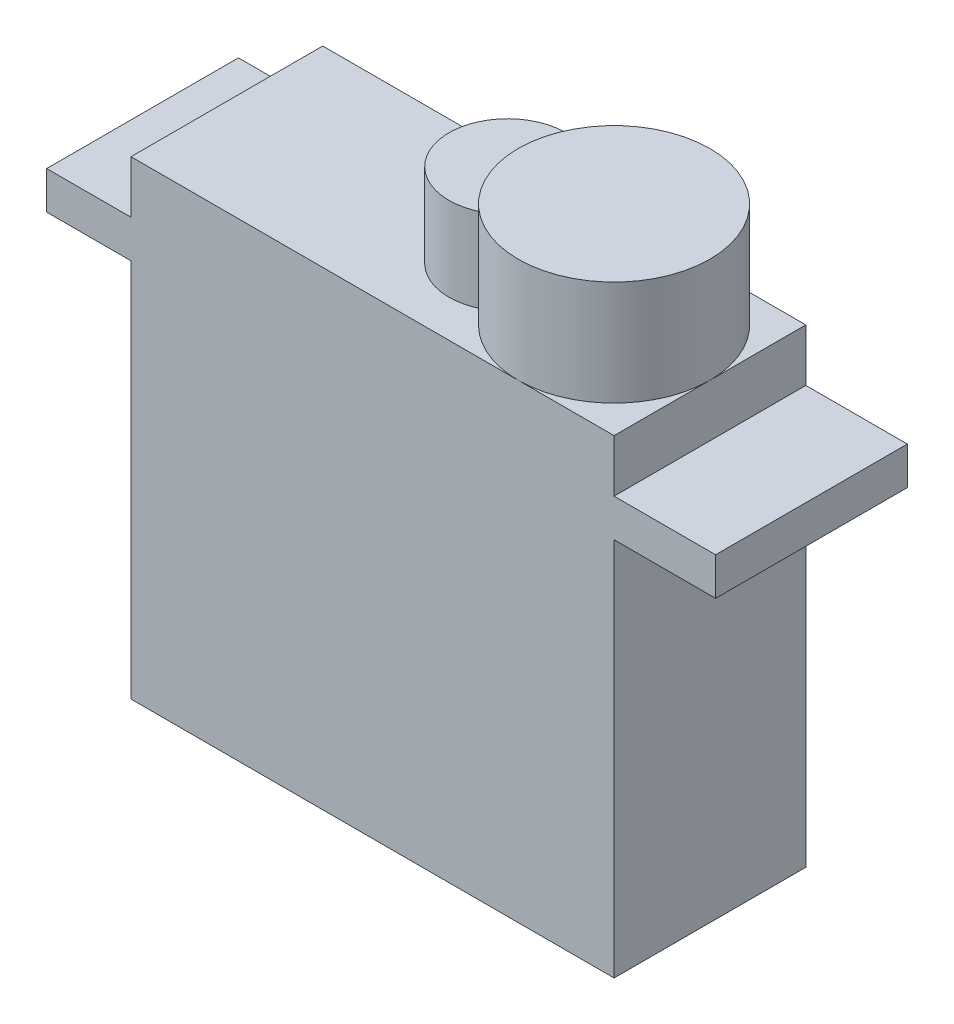
ISO-10303-21;
HEADER;
FILE_DESCRIPTION(('STEP AP214'),'2;1');
FILE_NAME('part.step','',(''),(''),'','','');
FILE_SCHEMA(('AUTOMOTIVE_DESIGN { 1 0 10303 214 1 1 1 1 }'));
ENDSEC;
DATA;
#1=APPLICATION_CONTEXT('core data for automotive mechanical design processes');
#2=APPLICATION_PROTOCOL_DEFINITION('international standard','automotive_design',2000,#1);
#3=PRODUCT_CONTEXT('',#1,'mechanical');
#4=PRODUCT('Part','Part','',(#3));
#5=PRODUCT_RELATED_PRODUCT_CATEGORY('part','',(#4));
#6=PRODUCT_DEFINITION_FORMATION('','',#4);
#7=PRODUCT_DEFINITION_CONTEXT('part definition',#1,'design');
#8=PRODUCT_DEFINITION('design','',#6,#7);
#9=PRODUCT_DEFINITION_SHAPE('','',#8);
#10=(LENGTH_UNIT() NAMED_UNIT(*) SI_UNIT(.MILLI.,.METRE.));
#11=(NAMED_UNIT(*) PLANE_ANGLE_UNIT() SI_UNIT($,.RADIAN.));
#12=(NAMED_UNIT(*) SI_UNIT($,.STERADIAN.) SOLID_ANGLE_UNIT());
#13=UNCERTAINTY_MEASURE_WITH_UNIT(LENGTH_MEASURE(1.E-05),#10,'distance_accuracy_value','');
#14=(GEOMETRIC_REPRESENTATION_CONTEXT(3) GLOBAL_UNCERTAINTY_ASSIGNED_CONTEXT((#13)) GLOBAL_UNIT_ASSIGNED_CONTEXT((#10,
#11,#12)) REPRESENTATION_CONTEXT('',''));
#15=CARTESIAN_POINT('',(0.,0.,0.));
#16=DIRECTION('',(0.,0.,1.));
#17=DIRECTION('',(1.,0.,0.));
#18=AXIS2_PLACEMENT_3D('',#15,#16,#17);
#19=CARTESIAN_POINT('',(0.,4.3,-9.144));
#20=DIRECTION('',(0.,-1.,0.));
#21=DIRECTION('',(0.,0.,-1.));
#22=AXIS2_PLACEMENT_3D('',#19,#20,#21);
#23=PLANE('',#22);
#24=CARTESIAN_POINT('',(13.3858,4.3,-4.572));
#25=DIRECTION('',(0.,1.,0.));
#26=DIRECTION('',(0.,0.,1.));
#27=AXIS2_PLACEMENT_3D('',#24,#25,#26);
#28=CIRCLE('',#27,2.794);
#29=CARTESIAN_POINT('',(14.63675,4.3,-7.07031144925928));
#30=VERTEX_POINT('',#29);
#31=CARTESIAN_POINT('',(14.63675,4.3,-2.07368855074072));
#32=VERTEX_POINT('',#31);
#33=EDGE_CURVE('E140',#30,#32,#28,.T.);
#34=ORIENTED_EDGE('',*,*,#33,.F.);
#35=CARTESIAN_POINT('',(18.4658,4.3,-4.572));
#36=DIRECTION('',(0.,1.,0.));
#37=DIRECTION('',(0.,0.,1.));
#38=AXIS2_PLACEMENT_3D('',#35,#36,#37);
#39=CIRCLE('',#38,4.572);
#40=CARTESIAN_POINT('',(18.4658,4.3,-9.144));
#41=VERTEX_POINT('',#40);
#42=EDGE_CURVE('E54',#41,#30,#39,.T.);
#43=ORIENTED_EDGE('',*,*,#42,.F.);
#44=DIRECTION('',(-1.,0.,0.));
#45=VECTOR('',#44,1.);
#46=CARTESIAN_POINT('',(0.,4.3,-9.144));
#47=LINE('',#46,#45);
#48=CARTESIAN_POINT('',(0.,4.3,-9.144));
#49=VERTEX_POINT('',#48);
#50=EDGE_CURVE('E351',#41,#49,#47,.T.);
#51=ORIENTED_EDGE('',*,*,#50,.T.);
#52=DIRECTION('',(0.,0.,1.));
#53=VECTOR('',#52,1.);
#54=CARTESIAN_POINT('',(0.,4.3,0.));
#55=LINE('',#54,#53);
#56=CARTESIAN_POINT('',(0.,4.3,0.));
#57=VERTEX_POINT('',#56);
#58=EDGE_CURVE('E179',#49,#57,#55,.T.);
#59=ORIENTED_EDGE('',*,*,#58,.T.);
#60=DIRECTION('',(1.,0.,0.));
#61=VECTOR('',#60,1.);
#62=CARTESIAN_POINT('',(0.,4.3,0.));
#63=LINE('',#62,#61);
#64=CARTESIAN_POINT('',(18.4658,4.3,0.));
#65=VERTEX_POINT('',#64);
#66=EDGE_CURVE('E154',#57,#65,#63,.T.);
#67=ORIENTED_EDGE('',*,*,#66,.T.);
#68=EDGE_CURVE('E150',#32,#65,#39,.T.);
#69=ORIENTED_EDGE('',*,*,#68,.F.);
#70=EDGE_LOOP('',(#34,#43,#51,#59,#67,#69));
#71=FACE_BOUND('',#70,.T.);
#72=ADVANCED_FACE('F32',(#71),#23,.F.);
#73=CARTESIAN_POINT('',(18.4658,9.3,-4.572));
#74=DIRECTION('',(0.,-1.,0.));
#75=DIRECTION('',(0.,0.,-1.));
#76=AXIS2_PLACEMENT_3D('',#73,#74,#75);
#77=CYLINDRICAL_SURFACE('',#76,4.572);
#78=CARTESIAN_POINT('',(18.4658,9.3,-4.572));
#79=DIRECTION('',(0.,1.,0.));
#80=DIRECTION('',(0.,0.,1.));
#81=AXIS2_PLACEMENT_3D('',#78,#79,#80);
#82=CIRCLE('',#81,4.572);
#83=CARTESIAN_POINT('',(18.4658,9.3,0.));
#84=VERTEX_POINT('',#83);
#85=EDGE_CURVE('E165',#84,#84,#82,.T.);
#86=ORIENTED_EDGE('',*,*,#85,.F.);
#87=EDGE_LOOP('',(#86));
#88=FACE_BOUND('',#87,.T.);
#89=DIRECTION('',(0.,-1.,0.));
#90=VECTOR('',#89,1.);
#91=CARTESIAN_POINT('',(14.63675,6.3,-7.07031144925928));
#92=LINE('',#91,#90);
#93=CARTESIAN_POINT('',(14.63675,8.3,-7.07031144925928));
#94=VERTEX_POINT('',#93);
#95=EDGE_CURVE('E11',#94,#30,#92,.T.);
#96=ORIENTED_EDGE('',*,*,#95,.F.);
#97=CARTESIAN_POINT('',(18.4658,8.3,-4.572));
#98=DIRECTION('',(0.,1.,0.));
#99=DIRECTION('',(0.,0.,1.));
#100=AXIS2_PLACEMENT_3D('',#97,#98,#99);
#101=CIRCLE('',#100,4.572);
#102=CARTESIAN_POINT('',(14.63675,8.3,-2.07368855074072));
#103=VERTEX_POINT('',#102);
#104=EDGE_CURVE('E152',#94,#103,#101,.T.);
#105=ORIENTED_EDGE('',*,*,#104,.T.);
#106=DIRECTION('',(0.,-1.,0.));
#107=VECTOR('',#106,1.);
#108=CARTESIAN_POINT('',(14.63675,6.3,-2.07368855074072));
#109=LINE('',#108,#107);
#110=EDGE_CURVE('E40',#32,#103,#109,.F.);
#111=ORIENTED_EDGE('',*,*,#110,.F.);
#112=ORIENTED_EDGE('',*,*,#68,.T.);
#113=CARTESIAN_POINT('',(23.0378,4.3,-4.572));
#114=VERTEX_POINT('',#113);
#115=EDGE_CURVE('E159',#65,#114,#39,.T.);
#116=ORIENTED_EDGE('',*,*,#115,.T.);
#117=EDGE_CURVE('E158',#114,#41,#39,.T.);
#118=ORIENTED_EDGE('',*,*,#117,.T.);
#119=ORIENTED_EDGE('',*,*,#42,.T.);
#120=EDGE_LOOP('',(#96,#105,#111,#112,#116,#118,#119));
#121=FACE_BOUND('',#120,.T.);
#122=ADVANCED_FACE('F148',(#88,#121),#77,.T.);
#123=ORIENTED_EDGE('',*,*,#115,.F.);
#124=CARTESIAN_POINT('',(23.0378,4.3,0.));
#125=VERTEX_POINT('',#124);
#126=EDGE_CURVE('E345',#65,#125,#63,.T.);
#127=ORIENTED_EDGE('',*,*,#126,.T.);
#128=DIRECTION('',(0.,0.,-1.));
#129=VECTOR('',#128,1.);
#130=CARTESIAN_POINT('',(23.0378,4.3,0.));
#131=LINE('',#130,#129);
#132=EDGE_CURVE('E348',#125,#114,#131,.T.);
#133=ORIENTED_EDGE('',*,*,#132,.T.);
#134=EDGE_LOOP('',(#123,#127,#133));
#135=FACE_BOUND('',#134,.T.);
#136=ADVANCED_FACE('F330',(#135),#23,.F.);
#137=ORIENTED_EDGE('',*,*,#117,.F.);
#138=CARTESIAN_POINT('',(23.0378,4.3,-9.144));
#139=VERTEX_POINT('',#138);
#140=EDGE_CURVE('E352',#114,#139,#131,.T.);
#141=ORIENTED_EDGE('',*,*,#140,.T.);
#142=EDGE_CURVE('E191',#139,#41,#47,.T.);
#143=ORIENTED_EDGE('',*,*,#142,.T.);
#144=EDGE_LOOP('',(#137,#141,#143));
#145=FACE_BOUND('',#144,.T.);
#146=ADVANCED_FACE('F329',(#145),#23,.F.);
#147=CARTESIAN_POINT('',(-4.02098022277668,1.8,0.));
#148=DIRECTION('',(0.,1.,0.));
#149=DIRECTION('',(0.,0.,1.));
#150=AXIS2_PLACEMENT_3D('',#147,#148,#149);
#151=PLANE('',#150);
#152=DIRECTION('',(0.,0.,1.));
#153=VECTOR('',#152,1.);
#154=CARTESIAN_POINT('',(0.,1.8,0.));
#155=LINE('',#154,#153);
#156=CARTESIAN_POINT('',(0.,1.8,-9.144));
#157=VERTEX_POINT('',#156);
#158=CARTESIAN_POINT('',(0.,1.8,0.));
#159=VERTEX_POINT('',#158);
#160=EDGE_CURVE('E168',#157,#159,#155,.T.);
#161=ORIENTED_EDGE('',*,*,#160,.F.);
#162=DIRECTION('',(-1.,0.,0.));
#163=VECTOR('',#162,1.);
#164=CARTESIAN_POINT('',(-4.02098022277668,1.8,-9.144));
#165=LINE('',#164,#163);
#166=CARTESIAN_POINT('',(-4.02098022277668,1.8,-9.144));
#167=VERTEX_POINT('',#166);
#168=EDGE_CURVE('E199',#157,#167,#165,.T.);
#169=ORIENTED_EDGE('',*,*,#168,.T.);
#170=DIRECTION('',(0.,0.,1.));
#171=VECTOR('',#170,1.);
#172=CARTESIAN_POINT('',(-4.02098022277668,1.8,-9.144));
#173=LINE('',#172,#171);
#174=CARTESIAN_POINT('',(-4.02098022277668,1.8,0.));
#175=VERTEX_POINT('',#174);
#176=EDGE_CURVE('E195',#167,#175,#173,.T.);
#177=ORIENTED_EDGE('',*,*,#176,.T.);
#178=DIRECTION('',(1.,0.,0.));
#179=VECTOR('',#178,1.);
#180=CARTESIAN_POINT('',(-4.02098022277668,1.8,0.));
#181=LINE('',#180,#179);
#182=EDGE_CURVE('E309',#175,#159,#181,.T.);
#183=ORIENTED_EDGE('',*,*,#182,.T.);
#184=EDGE_LOOP('',(#161,#169,#177,#183));
#185=FACE_BOUND('',#184,.T.);
#186=ADVANCED_FACE('F338',(#185),#151,.T.);
#187=CARTESIAN_POINT('',(0.,-18.1,0.));
#188=DIRECTION('',(-1.,0.,0.));
#189=DIRECTION('',(0.,0.,1.));
#190=AXIS2_PLACEMENT_3D('',#187,#188,#189);
#191=PLANE('',#190);
#192=DIRECTION('',(0.,0.,1.));
#193=VECTOR('',#192,1.);
#194=CARTESIAN_POINT('',(0.,0.,0.));
#195=LINE('',#194,#193);
#196=CARTESIAN_POINT('',(0.,0.,-9.144));
#197=VERTEX_POINT('',#196);
#198=CARTESIAN_POINT('',(0.,0.,0.));
#199=VERTEX_POINT('',#198);
#200=EDGE_CURVE('E253',#197,#199,#195,.T.);
#201=ORIENTED_EDGE('',*,*,#200,.F.);
#202=DIRECTION('',(0.,1.,0.));
#203=VECTOR('',#202,1.);
#204=CARTESIAN_POINT('',(0.,-18.1,-9.144));
#205=LINE('',#204,#203);
#206=CARTESIAN_POINT('',(0.,-18.1,-9.144));
#207=VERTEX_POINT('',#206);
#208=EDGE_CURVE('E156',#207,#197,#205,.T.);
#209=ORIENTED_EDGE('',*,*,#208,.F.);
#210=DIRECTION('',(0.,0.,1.));
#211=VECTOR('',#210,1.);
#212=CARTESIAN_POINT('',(0.,-18.1,0.));
#213=LINE('',#212,#211);
#214=CARTESIAN_POINT('',(0.,-18.1,0.));
#215=VERTEX_POINT('',#214);
#216=EDGE_CURVE('E261',#207,#215,#213,.T.);
#217=ORIENTED_EDGE('',*,*,#216,.T.);
#218=DIRECTION('',(0.,1.,0.));
#219=VECTOR('',#218,1.);
#220=CARTESIAN_POINT('',(0.,-18.1,0.));
#221=LINE('',#220,#219);
#222=EDGE_CURVE('E280',#215,#199,#221,.T.);
#223=ORIENTED_EDGE('',*,*,#222,.T.);
#224=EDGE_LOOP('',(#201,#209,#217,#223));
#225=FACE_BOUND('',#224,.T.);
#226=ADVANCED_FACE('F34',(#225),#191,.T.);
#227=CARTESIAN_POINT('',(0.,-18.1,-9.144));
#228=DIRECTION('',(0.,0.,-1.));
#229=DIRECTION('',(-1.,0.,0.));
#230=AXIS2_PLACEMENT_3D('',#227,#228,#229);
#231=PLANE('',#230);
#232=ORIENTED_EDGE('',*,*,#208,.T.);
#233=DIRECTION('',(-1.,0.,0.));
#234=VECTOR('',#233,1.);
#235=CARTESIAN_POINT('',(-4.02098022277668,0.,-9.144));
#236=LINE('',#235,#234);
#237=CARTESIAN_POINT('',(-4.02098022277668,0.,-9.144));
#238=VERTEX_POINT('',#237);
#239=EDGE_CURVE('E236',#197,#238,#236,.T.);
#240=ORIENTED_EDGE('',*,*,#239,.T.);
#241=DIRECTION('',(0.,-1.,0.));
#242=VECTOR('',#241,1.);
#243=CARTESIAN_POINT('',(-4.02098022277668,1.8,-9.144));
#244=LINE('',#243,#242);
#245=EDGE_CURVE('E242',#167,#238,#244,.T.);
#246=ORIENTED_EDGE('',*,*,#245,.F.);
#247=ORIENTED_EDGE('',*,*,#168,.F.);
#248=DIRECTION('',(0.,-1.,0.));
#249=VECTOR('',#248,1.);
#250=CARTESIAN_POINT('',(0.,4.3,-9.144));
#251=LINE('',#250,#249);
#252=EDGE_CURVE('E186',#49,#157,#251,.T.);
#253=ORIENTED_EDGE('',*,*,#252,.F.);
#254=ORIENTED_EDGE('',*,*,#50,.F.);
#255=ORIENTED_EDGE('',*,*,#142,.F.);
#256=DIRECTION('',(0.,-1.,0.));
#257=VECTOR('',#256,1.);
#258=CARTESIAN_POINT('',(23.0378,4.3,-9.144));
#259=LINE('',#258,#257);
#260=CARTESIAN_POINT('',(23.0378,1.8,-9.144));
#261=VERTEX_POINT('',#260);
#262=EDGE_CURVE('E202',#139,#261,#259,.T.);
#263=ORIENTED_EDGE('',*,*,#262,.T.);
#264=CARTESIAN_POINT('',(27.8790197772233,1.8,-9.144));
#265=VERTEX_POINT('',#264);
#266=EDGE_CURVE('E246',#265,#261,#165,.T.);
#267=ORIENTED_EDGE('',*,*,#266,.F.);
#268=DIRECTION('',(0.,-1.,0.));
#269=VECTOR('',#268,1.);
#270=CARTESIAN_POINT('',(27.8790197772233,1.8,-9.144));
#271=LINE('',#270,#269);
#272=CARTESIAN_POINT('',(27.8790197772233,0.,-9.144));
#273=VERTEX_POINT('',#272);
#274=EDGE_CURVE('E245',#265,#273,#271,.T.);
#275=ORIENTED_EDGE('',*,*,#274,.T.);
#276=CARTESIAN_POINT('',(23.0378,0.,-9.144));
#277=VERTEX_POINT('',#276);
#278=EDGE_CURVE('E238',#273,#277,#236,.T.);
#279=ORIENTED_EDGE('',*,*,#278,.T.);
#280=DIRECTION('',(0.,1.,0.));
#281=VECTOR('',#280,1.);
#282=CARTESIAN_POINT('',(23.0378,-18.1,-9.144));
#283=LINE('',#282,#281);
#284=CARTESIAN_POINT('',(23.0378,-18.1,-9.144));
#285=VERTEX_POINT('',#284);
#286=EDGE_CURVE('E160',#285,#277,#283,.T.);
#287=ORIENTED_EDGE('',*,*,#286,.F.);
#288=DIRECTION('',(-1.,0.,0.));
#289=VECTOR('',#288,1.);
#290=CARTESIAN_POINT('',(0.,-18.1,-9.144));
#291=LINE('',#290,#289);
#292=EDGE_CURVE('E271',#285,#207,#291,.T.);
#293=ORIENTED_EDGE('',*,*,#292,.T.);
#294=EDGE_LOOP('',(#232,#240,#246,#247,#253,#254,#255,#263,#267,#275,#279,#287,#293));
#295=FACE_BOUND('',#294,.T.);
#296=ADVANCED_FACE('F302',(#295),#231,.T.);
#297=CARTESIAN_POINT('',(23.0378,-18.1,0.));
#298=DIRECTION('',(1.,0.,0.));
#299=DIRECTION('',(0.,0.,-1.));
#300=AXIS2_PLACEMENT_3D('',#297,#298,#299);
#301=PLANE('',#300);
#302=DIRECTION('',(0.,0.,-1.));
#303=VECTOR('',#302,1.);
#304=CARTESIAN_POINT('',(23.0378,0.,0.));
#305=LINE('',#304,#303);
#306=CARTESIAN_POINT('',(23.0378,0.,0.));
#307=VERTEX_POINT('',#306);
#308=EDGE_CURVE('E255',#307,#277,#305,.T.);
#309=ORIENTED_EDGE('',*,*,#308,.F.);
#310=DIRECTION('',(0.,1.,0.));
#311=VECTOR('',#310,1.);
#312=CARTESIAN_POINT('',(23.0378,-18.1,0.));
#313=LINE('',#312,#311);
#314=CARTESIAN_POINT('',(23.0378,-18.1,0.));
#315=VERTEX_POINT('',#314);
#316=EDGE_CURVE('E276',#315,#307,#313,.T.);
#317=ORIENTED_EDGE('',*,*,#316,.F.);
#318=DIRECTION('',(0.,0.,-1.));
#319=VECTOR('',#318,1.);
#320=CARTESIAN_POINT('',(23.0378,-18.1,0.));
#321=LINE('',#320,#319);
#322=EDGE_CURVE('E285',#315,#285,#321,.T.);
#323=ORIENTED_EDGE('',*,*,#322,.T.);
#324=ORIENTED_EDGE('',*,*,#286,.T.);
#325=EDGE_LOOP('',(#309,#317,#323,#324));
#326=FACE_BOUND('',#325,.T.);
#327=ADVANCED_FACE('F319',(#326),#301,.T.);
#328=CARTESIAN_POINT('',(0.,-18.1,0.));
#329=DIRECTION('',(0.,0.,1.));
#330=DIRECTION('',(1.,0.,0.));
#331=AXIS2_PLACEMENT_3D('',#328,#329,#330);
#332=PLANE('',#331);
#333=ORIENTED_EDGE('',*,*,#316,.T.);
#334=DIRECTION('',(1.,0.,0.));
#335=VECTOR('',#334,1.);
#336=CARTESIAN_POINT('',(-4.02098022277668,0.,0.));
#337=LINE('',#336,#335);
#338=CARTESIAN_POINT('',(27.8790197772233,0.,0.));
#339=VERTEX_POINT('',#338);
#340=EDGE_CURVE('E216',#307,#339,#337,.T.);
#341=ORIENTED_EDGE('',*,*,#340,.T.);
#342=DIRECTION('',(0.,-1.,0.));
#343=VECTOR('',#342,1.);
#344=CARTESIAN_POINT('',(27.8790197772233,1.8,0.));
#345=LINE('',#344,#343);
#346=CARTESIAN_POINT('',(27.8790197772233,1.8,0.));
#347=VERTEX_POINT('',#346);
#348=EDGE_CURVE('E249',#347,#339,#345,.T.);
#349=ORIENTED_EDGE('',*,*,#348,.F.);
#350=CARTESIAN_POINT('',(23.0378,1.8,0.));
#351=VERTEX_POINT('',#350);
#352=EDGE_CURVE('E308',#351,#347,#181,.T.);
#353=ORIENTED_EDGE('',*,*,#352,.F.);
#354=DIRECTION('',(0.,-1.,0.));
#355=VECTOR('',#354,1.);
#356=CARTESIAN_POINT('',(23.0378,4.3,0.));
#357=LINE('',#356,#355);
#358=EDGE_CURVE('E205',#125,#351,#357,.T.);
#359=ORIENTED_EDGE('',*,*,#358,.F.);
#360=ORIENTED_EDGE('',*,*,#126,.F.);
#361=ORIENTED_EDGE('',*,*,#66,.F.);
#362=DIRECTION('',(0.,-1.,0.));
#363=VECTOR('',#362,1.);
#364=CARTESIAN_POINT('',(0.,4.3,0.));
#365=LINE('',#364,#363);
#366=EDGE_CURVE('E210',#57,#159,#365,.T.);
#367=ORIENTED_EDGE('',*,*,#366,.T.);
#368=ORIENTED_EDGE('',*,*,#182,.F.);
#369=DIRECTION('',(0.,-1.,0.));
#370=VECTOR('',#369,1.);
#371=CARTESIAN_POINT('',(-4.02098022277668,1.8,0.));
#372=LINE('',#371,#370);
#373=CARTESIAN_POINT('',(-4.02098022277668,0.,0.));
#374=VERTEX_POINT('',#373);
#375=EDGE_CURVE('E251',#175,#374,#372,.T.);
#376=ORIENTED_EDGE('',*,*,#375,.T.);
#377=EDGE_CURVE('E222',#374,#199,#337,.T.);
#378=ORIENTED_EDGE('',*,*,#377,.T.);
#379=ORIENTED_EDGE('',*,*,#222,.F.);
#380=DIRECTION('',(1.,0.,0.));
#381=VECTOR('',#380,1.);
#382=CARTESIAN_POINT('',(0.,-18.1,0.));
#383=LINE('',#382,#381);
#384=EDGE_CURVE('E289',#215,#315,#383,.T.);
#385=ORIENTED_EDGE('',*,*,#384,.T.);
#386=EDGE_LOOP('',(#333,#341,#349,#353,#359,#360,#361,#367,#368,#376,#378,#379,#385));
#387=FACE_BOUND('',#386,.T.);
#388=ADVANCED_FACE('F298',(#387),#332,.T.);
#389=CARTESIAN_POINT('',(0.,-18.1,-9.144));
#390=DIRECTION('',(0.,-1.,0.));
#391=DIRECTION('',(0.,0.,-1.));
#392=AXIS2_PLACEMENT_3D('',#389,#390,#391);
#393=PLANE('',#392);
#394=ORIENTED_EDGE('',*,*,#216,.F.);
#395=ORIENTED_EDGE('',*,*,#292,.F.);
#396=ORIENTED_EDGE('',*,*,#322,.F.);
#397=ORIENTED_EDGE('',*,*,#384,.F.);
#398=EDGE_LOOP('',(#394,#395,#396,#397));
#399=FACE_BOUND('',#398,.T.);
#400=ADVANCED_FACE('F297',(#399),#393,.T.);
#401=CARTESIAN_POINT('',(-4.02098022277668,0.,0.));
#402=DIRECTION('',(0.,1.,0.));
#403=DIRECTION('',(0.,0.,1.));
#404=AXIS2_PLACEMENT_3D('',#401,#402,#403);
#405=PLANE('',#404);
#406=ORIENTED_EDGE('',*,*,#239,.F.);
#407=ORIENTED_EDGE('',*,*,#200,.T.);
#408=ORIENTED_EDGE('',*,*,#377,.F.);
#409=DIRECTION('',(0.,0.,1.));
#410=VECTOR('',#409,1.);
#411=CARTESIAN_POINT('',(-4.02098022277668,0.,-9.144));
#412=LINE('',#411,#410);
#413=EDGE_CURVE('E213',#238,#374,#412,.T.);
#414=ORIENTED_EDGE('',*,*,#413,.F.);
#415=EDGE_LOOP('',(#406,#407,#408,#414));
#416=FACE_BOUND('',#415,.T.);
#417=ADVANCED_FACE('F300',(#416),#405,.F.);
#418=ORIENTED_EDGE('',*,*,#340,.F.);
#419=ORIENTED_EDGE('',*,*,#308,.T.);
#420=ORIENTED_EDGE('',*,*,#278,.F.);
#421=DIRECTION('',(0.,0.,-1.));
#422=VECTOR('',#421,1.);
#423=CARTESIAN_POINT('',(27.8790197772233,0.,-9.144));
#424=LINE('',#423,#422);
#425=EDGE_CURVE('E229',#339,#273,#424,.T.);
#426=ORIENTED_EDGE('',*,*,#425,.F.);
#427=EDGE_LOOP('',(#418,#419,#420,#426));
#428=FACE_BOUND('',#427,.T.);
#429=ADVANCED_FACE('F318',(#428),#405,.F.);
#430=CARTESIAN_POINT('',(-4.02098022277668,1.8,-9.144));
#431=DIRECTION('',(1.,0.,0.));
#432=DIRECTION('',(0.,0.,-1.));
#433=AXIS2_PLACEMENT_3D('',#430,#431,#432);
#434=PLANE('',#433);
#435=ORIENTED_EDGE('',*,*,#413,.T.);
#436=ORIENTED_EDGE('',*,*,#375,.F.);
#437=ORIENTED_EDGE('',*,*,#176,.F.);
#438=ORIENTED_EDGE('',*,*,#245,.T.);
#439=EDGE_LOOP('',(#435,#436,#437,#438));
#440=FACE_BOUND('',#439,.T.);
#441=ADVANCED_FACE('F305',(#440),#434,.F.);
#442=CARTESIAN_POINT('',(27.8790197772233,1.8,-9.144));
#443=DIRECTION('',(-1.,0.,0.));
#444=DIRECTION('',(0.,0.,1.));
#445=AXIS2_PLACEMENT_3D('',#442,#443,#444);
#446=PLANE('',#445);
#447=ORIENTED_EDGE('',*,*,#425,.T.);
#448=ORIENTED_EDGE('',*,*,#274,.F.);
#449=DIRECTION('',(0.,0.,-1.));
#450=VECTOR('',#449,1.);
#451=CARTESIAN_POINT('',(27.8790197772233,1.8,-9.144));
#452=LINE('',#451,#450);
#453=EDGE_CURVE('E484',#347,#265,#452,.T.);
#454=ORIENTED_EDGE('',*,*,#453,.F.);
#455=ORIENTED_EDGE('',*,*,#348,.T.);
#456=EDGE_LOOP('',(#447,#448,#454,#455));
#457=FACE_BOUND('',#456,.T.);
#458=ADVANCED_FACE('F366',(#457),#446,.F.);
#459=DIRECTION('',(0.,0.,-1.));
#460=VECTOR('',#459,1.);
#461=CARTESIAN_POINT('',(23.0378,1.8,0.));
#462=LINE('',#461,#460);
#463=EDGE_CURVE('E173',#351,#261,#462,.T.);
#464=ORIENTED_EDGE('',*,*,#463,.F.);
#465=ORIENTED_EDGE('',*,*,#352,.T.);
#466=ORIENTED_EDGE('',*,*,#453,.T.);
#467=ORIENTED_EDGE('',*,*,#266,.T.);
#468=EDGE_LOOP('',(#464,#465,#466,#467));
#469=FACE_BOUND('',#468,.T.);
#470=ADVANCED_FACE('F359',(#469),#151,.T.);
#471=CARTESIAN_POINT('',(0.,4.3,0.));
#472=DIRECTION('',(1.,0.,0.));
#473=DIRECTION('',(0.,0.,-1.));
#474=AXIS2_PLACEMENT_3D('',#471,#472,#473);
#475=PLANE('',#474);
#476=ORIENTED_EDGE('',*,*,#160,.T.);
#477=ORIENTED_EDGE('',*,*,#366,.F.);
#478=ORIENTED_EDGE('',*,*,#58,.F.);
#479=ORIENTED_EDGE('',*,*,#252,.T.);
#480=EDGE_LOOP('',(#476,#477,#478,#479));
#481=FACE_BOUND('',#480,.T.);
#482=ADVANCED_FACE('F356',(#481),#475,.F.);
#483=CARTESIAN_POINT('',(23.0378,4.3,0.));
#484=DIRECTION('',(-1.,0.,0.));
#485=DIRECTION('',(0.,0.,1.));
#486=AXIS2_PLACEMENT_3D('',#483,#484,#485);
#487=PLANE('',#486);
#488=ORIENTED_EDGE('',*,*,#463,.T.);
#489=ORIENTED_EDGE('',*,*,#262,.F.);
#490=ORIENTED_EDGE('',*,*,#140,.F.);
#491=ORIENTED_EDGE('',*,*,#132,.F.);
#492=ORIENTED_EDGE('',*,*,#358,.T.);
#493=EDGE_LOOP('',(#488,#489,#490,#491,#492));
#494=FACE_BOUND('',#493,.T.);
#495=ADVANCED_FACE('F358',(#494),#487,.F.);
#496=CARTESIAN_POINT('',(18.4658,9.3,-4.572));
#497=DIRECTION('',(0.,1.,0.));
#498=DIRECTION('',(0.,0.,1.));
#499=AXIS2_PLACEMENT_3D('',#496,#497,#498);
#500=PLANE('',#499);
#501=ORIENTED_EDGE('',*,*,#85,.T.);
#502=EDGE_LOOP('',(#501));
#503=FACE_BOUND('',#502,.T.);
#504=ADVANCED_FACE('F365',(#503),#500,.T.);
#505=CARTESIAN_POINT('',(13.3858,8.3,-4.572));
#506=DIRECTION('',(0.,-1.,0.));
#507=DIRECTION('',(0.,0.,-1.));
#508=AXIS2_PLACEMENT_3D('',#505,#506,#507);
#509=CYLINDRICAL_SURFACE('',#508,2.794);
#510=CARTESIAN_POINT('',(13.3858,8.3,-4.572));
#511=DIRECTION('',(0.,1.,0.));
#512=DIRECTION('',(0.,0.,1.));
#513=AXIS2_PLACEMENT_3D('',#510,#511,#512);
#514=CIRCLE('',#513,2.794);
#515=EDGE_CURVE('E46',#94,#103,#514,.T.);
#516=ORIENTED_EDGE('',*,*,#515,.F.);
#517=ORIENTED_EDGE('',*,*,#95,.T.);
#518=ORIENTED_EDGE('',*,*,#33,.T.);
#519=ORIENTED_EDGE('',*,*,#110,.T.);
#520=EDGE_LOOP('',(#516,#517,#518,#519));
#521=FACE_BOUND('',#520,.T.);
#522=ADVANCED_FACE('F142',(#521),#509,.T.);
#523=CARTESIAN_POINT('',(13.3858,8.3,-4.572));
#524=DIRECTION('',(0.,1.,0.));
#525=DIRECTION('',(0.,0.,1.));
#526=AXIS2_PLACEMENT_3D('',#523,#524,#525);
#527=PLANE('',#526);
#528=ORIENTED_EDGE('',*,*,#104,.F.);
#529=ORIENTED_EDGE('',*,*,#515,.T.);
#530=EDGE_LOOP('',(#528,#529));
#531=FACE_BOUND('',#530,.T.);
#532=ADVANCED_FACE('F468',(#531),#527,.T.);
#533=CLOSED_SHELL('',(#72,#122,#136,#146,#186,#226,#296,#327,#388,#400,#417,#429,#441,#458,#470,
#482,#495,#504,#522,#532));
#534=MANIFOLD_SOLID_BREP('B2',#533);
#535=ADVANCED_BREP_SHAPE_REPRESENTATION('',(#18,#534),#14);
#536=SHAPE_DEFINITION_REPRESENTATION(#9,#535);
ENDSEC;
END-ISO-10303-21;
